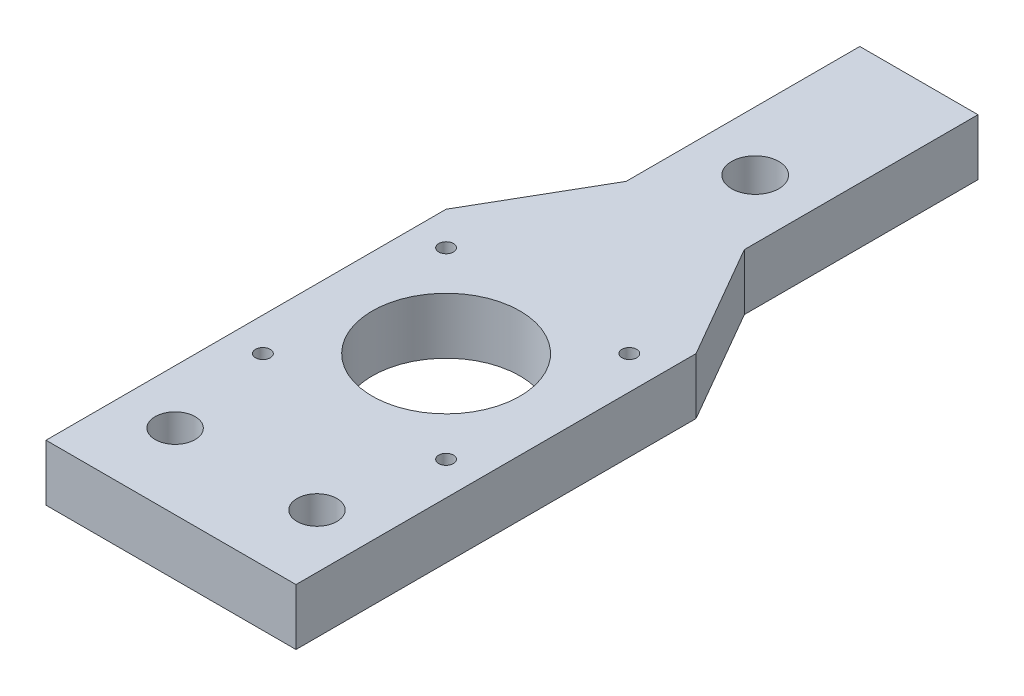
ISO-10303-21;
HEADER;
FILE_DESCRIPTION(('STEP AP214'),'2;1');
FILE_NAME('part.step','',(''),(''),'','','');
FILE_SCHEMA(('AUTOMOTIVE_DESIGN { 1 0 10303 214 1 1 1 1 }'));
ENDSEC;
DATA;
#1=APPLICATION_CONTEXT('core data for automotive mechanical design processes');
#2=APPLICATION_PROTOCOL_DEFINITION('international standard','automotive_design',2000,#1);
#3=PRODUCT_CONTEXT('',#1,'mechanical');
#4=PRODUCT('Part','Part','',(#3));
#5=PRODUCT_RELATED_PRODUCT_CATEGORY('part','',(#4));
#6=PRODUCT_DEFINITION_FORMATION('','',#4);
#7=PRODUCT_DEFINITION_CONTEXT('part definition',#1,'design');
#8=PRODUCT_DEFINITION('design','',#6,#7);
#9=PRODUCT_DEFINITION_SHAPE('','',#8);
#10=(LENGTH_UNIT() NAMED_UNIT(*) SI_UNIT(.MILLI.,.METRE.));
#11=(NAMED_UNIT(*) PLANE_ANGLE_UNIT() SI_UNIT($,.RADIAN.));
#12=(NAMED_UNIT(*) SI_UNIT($,.STERADIAN.) SOLID_ANGLE_UNIT());
#13=UNCERTAINTY_MEASURE_WITH_UNIT(LENGTH_MEASURE(1.E-05),#10,'distance_accuracy_value','');
#14=(GEOMETRIC_REPRESENTATION_CONTEXT(3) GLOBAL_UNCERTAINTY_ASSIGNED_CONTEXT((#13)) GLOBAL_UNIT_ASSIGNED_CONTEXT((#10,
#11,#12)) REPRESENTATION_CONTEXT('',''));
#15=CARTESIAN_POINT('',(0.,0.,0.));
#16=DIRECTION('',(0.,0.,1.));
#17=DIRECTION('',(1.,0.,0.));
#18=AXIS2_PLACEMENT_3D('',#15,#16,#17);
#19=CARTESIAN_POINT('',(0.,9.525,0.));
#20=DIRECTION('',(1.,0.,0.));
#21=DIRECTION('',(0.,0.,-1.));
#22=AXIS2_PLACEMENT_3D('',#19,#20,#21);
#23=PLANE('',#22);
#24=DIRECTION('',(0.,0.,1.));
#25=VECTOR('',#24,1.);
#26=CARTESIAN_POINT('',(0.,0.,0.));
#27=LINE('',#26,#25);
#28=CARTESIAN_POINT('',(0.,0.,0.));
#29=VERTEX_POINT('',#28);
#30=CARTESIAN_POINT('',(0.,0.,39.5376334956069));
#31=VERTEX_POINT('',#30);
#32=EDGE_CURVE('E148',#29,#31,#27,.T.);
#33=ORIENTED_EDGE('',*,*,#32,.T.);
#34=DIRECTION('',(0.,-1.,0.));
#35=VECTOR('',#34,1.);
#36=CARTESIAN_POINT('',(0.,9.525,39.5376334956069));
#37=LINE('',#36,#35);
#38=CARTESIAN_POINT('',(0.,9.525,39.5376334956069));
#39=VERTEX_POINT('',#38);
#40=EDGE_CURVE('E11',#39,#31,#37,.T.);
#41=ORIENTED_EDGE('',*,*,#40,.F.);
#42=DIRECTION('',(0.,0.,1.));
#43=VECTOR('',#42,1.);
#44=CARTESIAN_POINT('',(0.,9.525,0.));
#45=LINE('',#44,#43);
#46=CARTESIAN_POINT('',(0.,9.525,0.));
#47=VERTEX_POINT('',#46);
#48=EDGE_CURVE('E97',#47,#39,#45,.T.);
#49=ORIENTED_EDGE('',*,*,#48,.F.);
#50=DIRECTION('',(0.,-1.,0.));
#51=VECTOR('',#50,1.);
#52=CARTESIAN_POINT('',(0.,9.525,0.));
#53=LINE('',#52,#51);
#54=EDGE_CURVE('E65',#47,#29,#53,.T.);
#55=ORIENTED_EDGE('',*,*,#54,.T.);
#56=EDGE_LOOP('',(#33,#41,#49,#55));
#57=FACE_BOUND('',#56,.T.);
#58=ADVANCED_FACE('F47',(#57),#23,.F.);
#59=CARTESIAN_POINT('',(17.120297506357,9.525,9.88440837390164));
#60=DIRECTION('',(-0.86602540378444,0.,-0.499999999999998));
#61=DIRECTION('',(-0.499999999999998,0.,0.86602540378444));
#62=AXIS2_PLACEMENT_3D('',#59,#60,#61);
#63=PLANE('',#62);
#64=DIRECTION('',(0.499999999999998,0.,-0.86602540378444));
#65=VECTOR('',#64,1.);
#66=CARTESIAN_POINT('',(17.120297506357,0.,9.88440837390164));
#67=LINE('',#66,#65);
#68=CARTESIAN_POINT('',(-11.15,0.,58.85));
#69=VERTEX_POINT('',#68);
#70=EDGE_CURVE('E151',#69,#31,#67,.T.);
#71=ORIENTED_EDGE('',*,*,#70,.F.);
#72=DIRECTION('',(0.,-1.,0.));
#73=VECTOR('',#72,1.);
#74=CARTESIAN_POINT('',(-11.15,9.525,58.85));
#75=LINE('',#74,#73);
#76=CARTESIAN_POINT('',(-11.15,9.525,58.85));
#77=VERTEX_POINT('',#76);
#78=EDGE_CURVE('E57',#77,#69,#75,.T.);
#79=ORIENTED_EDGE('',*,*,#78,.F.);
#80=DIRECTION('',(0.499999999999998,0.,-0.86602540378444));
#81=VECTOR('',#80,1.);
#82=CARTESIAN_POINT('',(17.120297506357,9.525,9.88440837390164));
#83=LINE('',#82,#81);
#84=EDGE_CURVE('E257',#77,#39,#83,.T.);
#85=ORIENTED_EDGE('',*,*,#84,.T.);
#86=ORIENTED_EDGE('',*,*,#40,.T.);
#87=EDGE_LOOP('',(#71,#79,#85,#86));
#88=FACE_BOUND('',#87,.T.);
#89=ADVANCED_FACE('F190',(#88),#63,.T.);
#90=CARTESIAN_POINT('',(-11.15,9.525,0.));
#91=DIRECTION('',(-1.,0.,0.));
#92=DIRECTION('',(0.,0.,1.));
#93=AXIS2_PLACEMENT_3D('',#90,#91,#92);
#94=PLANE('',#93);
#95=DIRECTION('',(0.,0.,-1.));
#96=VECTOR('',#95,1.);
#97=CARTESIAN_POINT('',(-11.15,0.,0.));
#98=LINE('',#97,#96);
#99=CARTESIAN_POINT('',(-11.15,0.,126.55));
#100=VERTEX_POINT('',#99);
#101=EDGE_CURVE('E155',#100,#69,#98,.T.);
#102=ORIENTED_EDGE('',*,*,#101,.F.);
#103=DIRECTION('',(0.,1.,0.));
#104=VECTOR('',#103,1.);
#105=CARTESIAN_POINT('',(-11.15,-49.3401459260104,126.55));
#106=LINE('',#105,#104);
#107=CARTESIAN_POINT('',(-11.15,9.525,126.55));
#108=VERTEX_POINT('',#107);
#109=EDGE_CURVE('E206',#100,#108,#106,.T.);
#110=ORIENTED_EDGE('',*,*,#109,.T.);
#111=DIRECTION('',(0.,0.,-1.));
#112=VECTOR('',#111,1.);
#113=CARTESIAN_POINT('',(-11.15,9.525,0.));
#114=LINE('',#113,#112);
#115=EDGE_CURVE('E187',#108,#77,#114,.T.);
#116=ORIENTED_EDGE('',*,*,#115,.T.);
#117=ORIENTED_EDGE('',*,*,#78,.T.);
#118=EDGE_LOOP('',(#102,#110,#116,#117));
#119=FACE_BOUND('',#118,.T.);
#120=ADVANCED_FACE('F183',(#119),#94,.T.);
#121=CARTESIAN_POINT('',(31.15,9.525,0.));
#122=DIRECTION('',(-1.,0.,0.));
#123=DIRECTION('',(0.,0.,1.));
#124=AXIS2_PLACEMENT_3D('',#121,#122,#123);
#125=PLANE('',#124);
#126=DIRECTION('',(0.,0.,-1.));
#127=VECTOR('',#126,1.);
#128=CARTESIAN_POINT('',(31.15,0.,0.));
#129=LINE('',#128,#127);
#130=CARTESIAN_POINT('',(31.15,0.,126.55));
#131=VERTEX_POINT('',#130);
#132=CARTESIAN_POINT('',(31.15,0.,58.85));
#133=VERTEX_POINT('',#132);
#134=EDGE_CURVE('E159',#131,#133,#129,.T.);
#135=ORIENTED_EDGE('',*,*,#134,.T.);
#136=DIRECTION('',(0.,-1.,0.));
#137=VECTOR('',#136,1.);
#138=CARTESIAN_POINT('',(31.15,9.525,58.85));
#139=LINE('',#138,#137);
#140=CARTESIAN_POINT('',(31.15,9.525,58.85));
#141=VERTEX_POINT('',#140);
#142=EDGE_CURVE('E120',#141,#133,#139,.T.);
#143=ORIENTED_EDGE('',*,*,#142,.F.);
#144=DIRECTION('',(0.,0.,-1.));
#145=VECTOR('',#144,1.);
#146=CARTESIAN_POINT('',(31.15,9.525,0.));
#147=LINE('',#146,#145);
#148=CARTESIAN_POINT('',(31.15,9.525,126.55));
#149=VERTEX_POINT('',#148);
#150=EDGE_CURVE('E127',#149,#141,#147,.T.);
#151=ORIENTED_EDGE('',*,*,#150,.F.);
#152=DIRECTION('',(0.,1.,0.));
#153=VECTOR('',#152,1.);
#154=CARTESIAN_POINT('',(31.15,-49.3401459260104,126.55));
#155=LINE('',#154,#153);
#156=EDGE_CURVE('E203',#131,#149,#155,.T.);
#157=ORIENTED_EDGE('',*,*,#156,.F.);
#158=EDGE_LOOP('',(#135,#143,#151,#157));
#159=FACE_BOUND('',#158,.T.);
#160=ADVANCED_FACE('F266',(#159),#125,.F.);
#161=CARTESIAN_POINT('',(-2.12029750635697,9.525,1.22415433605728));
#162=DIRECTION('',(0.86602540378444,0.,-0.499999999999998));
#163=DIRECTION('',(-0.499999999999998,0.,-0.86602540378444));
#164=AXIS2_PLACEMENT_3D('',#161,#162,#163);
#165=PLANE('',#164);
#166=DIRECTION('',(0.499999999999998,0.,0.86602540378444));
#167=VECTOR('',#166,1.);
#168=CARTESIAN_POINT('',(-2.12029750635697,0.,1.22415433605728));
#169=LINE('',#168,#167);
#170=CARTESIAN_POINT('',(20.,0.,39.5376334956069));
#171=VERTEX_POINT('',#170);
#172=EDGE_CURVE('E115',#171,#133,#169,.T.);
#173=ORIENTED_EDGE('',*,*,#172,.F.);
#174=DIRECTION('',(0.,-1.,0.));
#175=VECTOR('',#174,1.);
#176=CARTESIAN_POINT('',(20.,9.525,39.5376334956069));
#177=LINE('',#176,#175);
#178=CARTESIAN_POINT('',(20.,9.525,39.5376334956069));
#179=VERTEX_POINT('',#178);
#180=EDGE_CURVE('E110',#179,#171,#177,.T.);
#181=ORIENTED_EDGE('',*,*,#180,.F.);
#182=DIRECTION('',(0.499999999999998,0.,0.86602540378444));
#183=VECTOR('',#182,1.);
#184=CARTESIAN_POINT('',(-2.12029750635697,9.525,1.22415433605728));
#185=LINE('',#184,#183);
#186=EDGE_CURVE('E113',#179,#141,#185,.T.);
#187=ORIENTED_EDGE('',*,*,#186,.T.);
#188=ORIENTED_EDGE('',*,*,#142,.T.);
#189=EDGE_LOOP('',(#173,#181,#187,#188));
#190=FACE_BOUND('',#189,.T.);
#191=ADVANCED_FACE('F112',(#190),#165,.T.);
#192=CARTESIAN_POINT('',(20.,9.525,0.));
#193=DIRECTION('',(1.,0.,0.));
#194=DIRECTION('',(0.,0.,-1.));
#195=AXIS2_PLACEMENT_3D('',#192,#193,#194);
#196=PLANE('',#195);
#197=DIRECTION('',(0.,0.,1.));
#198=VECTOR('',#197,1.);
#199=CARTESIAN_POINT('',(20.,0.,0.));
#200=LINE('',#199,#198);
#201=CARTESIAN_POINT('',(20.,0.,0.));
#202=VERTEX_POINT('',#201);
#203=EDGE_CURVE('E165',#202,#171,#200,.T.);
#204=ORIENTED_EDGE('',*,*,#203,.F.);
#205=DIRECTION('',(0.,-1.,0.));
#206=VECTOR('',#205,1.);
#207=CARTESIAN_POINT('',(20.,9.525,0.));
#208=LINE('',#207,#206);
#209=CARTESIAN_POINT('',(20.,9.525,0.));
#210=VERTEX_POINT('',#209);
#211=EDGE_CURVE('E85',#210,#202,#208,.T.);
#212=ORIENTED_EDGE('',*,*,#211,.F.);
#213=DIRECTION('',(0.,0.,1.));
#214=VECTOR('',#213,1.);
#215=CARTESIAN_POINT('',(20.,9.525,0.));
#216=LINE('',#215,#214);
#217=EDGE_CURVE('E124',#210,#179,#216,.T.);
#218=ORIENTED_EDGE('',*,*,#217,.T.);
#219=ORIENTED_EDGE('',*,*,#180,.T.);
#220=EDGE_LOOP('',(#204,#212,#218,#219));
#221=FACE_BOUND('',#220,.T.);
#222=ADVANCED_FACE('F131',(#221),#196,.T.);
#223=CARTESIAN_POINT('',(10.,9.525,27.7));
#224=DIRECTION('',(0.,-1.,0.));
#225=DIRECTION('',(0.,0.,-1.));
#226=AXIS2_PLACEMENT_3D('',#223,#224,#225);
#227=CYLINDRICAL_SURFACE('',#226,4.);
#228=CARTESIAN_POINT('',(10.,9.525,27.7));
#229=DIRECTION('',(0.,1.,0.));
#230=DIRECTION('',(0.,0.,1.));
#231=AXIS2_PLACEMENT_3D('',#228,#229,#230);
#232=CIRCLE('',#231,4.);
#233=CARTESIAN_POINT('',(10.,9.525,23.7));
#234=VERTEX_POINT('',#233);
#235=EDGE_CURVE('E251',#234,#234,#232,.T.);
#236=CARTESIAN_POINT('',(10.,0.,27.7));
#237=DIRECTION('',(0.,1.,0.));
#238=DIRECTION('',(0.,0.,1.));
#239=AXIS2_PLACEMENT_3D('',#236,#237,#238);
#240=CIRCLE('',#239,4.);
#241=CARTESIAN_POINT('',(10.,0.,23.7));
#242=VERTEX_POINT('',#241);
#243=EDGE_CURVE('E143',#242,#242,#240,.T.);
#244=CARTESIAN_POINT('',(10.,9.525,23.7));
#245=CARTESIAN_POINT('',(10.,9.42578125,23.7));
#246=CARTESIAN_POINT('',(10.,9.3265625,23.7));
#247=CARTESIAN_POINT('',(10.,9.128125,23.7));
#248=CARTESIAN_POINT('',(10.,9.02890625,23.7));
#249=CARTESIAN_POINT('',(10.,8.83046875,23.7));
#250=CARTESIAN_POINT('',(10.,8.73125,23.7));
#251=CARTESIAN_POINT('',(10.,8.5328125,23.7));
#252=CARTESIAN_POINT('',(10.,8.43359375,23.7));
#253=CARTESIAN_POINT('',(10.,8.23515625,23.7));
#254=CARTESIAN_POINT('',(10.,8.1359375,23.7));
#255=CARTESIAN_POINT('',(10.,7.9375,23.7));
#256=CARTESIAN_POINT('',(10.,7.83828125,23.7));
#257=CARTESIAN_POINT('',(10.,7.63984375,23.7));
#258=CARTESIAN_POINT('',(10.,7.540625,23.7));
#259=CARTESIAN_POINT('',(10.,7.3421875,23.7));
#260=CARTESIAN_POINT('',(10.,7.24296875,23.7));
#261=CARTESIAN_POINT('',(10.,7.04453125,23.7));
#262=CARTESIAN_POINT('',(10.,6.9453125,23.7));
#263=CARTESIAN_POINT('',(10.,6.746875,23.7));
#264=CARTESIAN_POINT('',(10.,6.64765625,23.7));
#265=CARTESIAN_POINT('',(10.,6.44921875,23.7));
#266=CARTESIAN_POINT('',(10.,6.35,23.7));
#267=CARTESIAN_POINT('',(10.,6.1515625,23.7));
#268=CARTESIAN_POINT('',(10.,6.05234375,23.7));
#269=CARTESIAN_POINT('',(10.,5.85390625,23.7));
#270=CARTESIAN_POINT('',(10.,5.7546875,23.7));
#271=CARTESIAN_POINT('',(10.,5.55625,23.7));
#272=CARTESIAN_POINT('',(10.,5.45703125,23.7));
#273=CARTESIAN_POINT('',(10.,5.25859375,23.7));
#274=CARTESIAN_POINT('',(10.,5.159375,23.7));
#275=CARTESIAN_POINT('',(10.,4.9609375,23.7));
#276=CARTESIAN_POINT('',(10.,4.86171875,23.7));
#277=CARTESIAN_POINT('',(10.,4.66328125,23.7));
#278=CARTESIAN_POINT('',(10.,4.5640625,23.7));
#279=CARTESIAN_POINT('',(10.,4.365625,23.7));
#280=CARTESIAN_POINT('',(10.,4.26640625,23.7));
#281=CARTESIAN_POINT('',(10.,4.06796875,23.7));
#282=CARTESIAN_POINT('',(10.,3.96875,23.7));
#283=CARTESIAN_POINT('',(10.,3.7703125,23.7));
#284=CARTESIAN_POINT('',(10.,3.67109375,23.7));
#285=CARTESIAN_POINT('',(10.,3.47265625,23.7));
#286=CARTESIAN_POINT('',(10.,3.3734375,23.7));
#287=CARTESIAN_POINT('',(10.,3.175,23.7));
#288=CARTESIAN_POINT('',(10.,3.07578125,23.7));
#289=CARTESIAN_POINT('',(10.,2.87734375,23.7));
#290=CARTESIAN_POINT('',(10.,2.778125,23.7));
#291=CARTESIAN_POINT('',(10.,2.5796875,23.7));
#292=CARTESIAN_POINT('',(10.,2.48046875,23.7));
#293=CARTESIAN_POINT('',(10.,2.28203125,23.7));
#294=CARTESIAN_POINT('',(10.,2.1828125,23.7));
#295=CARTESIAN_POINT('',(10.,1.984375,23.7));
#296=CARTESIAN_POINT('',(10.,1.88515625,23.7));
#297=CARTESIAN_POINT('',(10.,1.68671875,23.7));
#298=CARTESIAN_POINT('',(10.,1.5875,23.7));
#299=CARTESIAN_POINT('',(10.,1.3890625,23.7));
#300=CARTESIAN_POINT('',(10.,1.28984375,23.7));
#301=CARTESIAN_POINT('',(10.,1.09140625,23.7));
#302=CARTESIAN_POINT('',(10.,0.992187500000001,23.7));
#303=CARTESIAN_POINT('',(10.,0.793750000000001,23.7));
#304=CARTESIAN_POINT('',(10.,0.69453125,23.7));
#305=CARTESIAN_POINT('',(10.,0.49609375,23.7));
#306=CARTESIAN_POINT('',(10.,0.396875,23.7));
#307=CARTESIAN_POINT('',(10.,0.1984375,23.7));
#308=CARTESIAN_POINT('',(10.,0.0992187500000001,23.7));
#309=CARTESIAN_POINT('',(10.,0.,23.7));
#310=B_SPLINE_CURVE_WITH_KNOTS('',3,(#244,#245,#246,#247,#248,#249,#250,#251,#252,#253,#254,
#255,#256,#257,#258,#259,#260,#261,#262,#263,#264,#265,#266,#267,#268,#269,#270,#271,#272,#273,
#274,#275,#276,#277,#278,#279,#280,#281,#282,#283,#284,#285,#286,#287,#288,#289,#290,#291,#292,
#293,#294,#295,#296,#297,#298,#299,#300,#301,#302,#303,#304,#305,#306,#307,#308,#309),
.UNSPECIFIED.,.F.,.F.,(4,2,2,2,2,2,2,2,2,2,2,2,2,2,2,2,2,2,2,2,2,2,2,2,2,2,2,2,2,2,2,2,4),(0.,
0.297656249999998,0.595312499999999,0.892968749999999,1.190625,1.48828125,1.7859375,2.08359375,
2.38125,2.67890625,2.9765625,3.27421875,3.571875,3.86953125,4.1671875,4.46484375,4.7625,
5.06015625,5.3578125,5.65546875,5.953125,6.25078125,6.5484375,6.84609375,7.14375,7.44140625,
7.7390625,8.03671875,8.334375,8.63203125,8.9296875,9.22734375,9.525),.UNSPECIFIED.);
#311=EDGE_CURVE('BSEAM277',#234,#242,#310,.T.);
#312=ORIENTED_EDGE('',*,*,#235,.T.);
#313=ORIENTED_EDGE('',*,*,#243,.F.);
#314=ORIENTED_EDGE('',*,*,#311,.T.);
#315=ORIENTED_EDGE('',*,*,#311,.F.);
#316=EDGE_LOOP('',(#312,#314,#313,#315));
#317=FACE_BOUND('',#316,.T.);
#318=ADVANCED_FACE('F277',(#317),#227,.F.);
#319=CARTESIAN_POINT('',(10.,9.525,80.));
#320=DIRECTION('',(0.,-1.,0.));
#321=DIRECTION('',(0.,0.,-1.));
#322=AXIS2_PLACEMENT_3D('',#319,#320,#321);
#323=CYLINDRICAL_SURFACE('',#322,12.5);
#324=CARTESIAN_POINT('',(10.,9.525,80.));
#325=DIRECTION('',(0.,1.,0.));
#326=DIRECTION('',(0.,0.,1.));
#327=AXIS2_PLACEMENT_3D('',#324,#325,#326);
#328=CIRCLE('',#327,12.5);
#329=CARTESIAN_POINT('',(10.,9.525,67.5));
#330=VERTEX_POINT('',#329);
#331=EDGE_CURVE('E172',#330,#330,#328,.T.);
#332=CARTESIAN_POINT('',(10.,0.,80.));
#333=DIRECTION('',(0.,1.,0.));
#334=DIRECTION('',(0.,0.,1.));
#335=AXIS2_PLACEMENT_3D('',#332,#333,#334);
#336=CIRCLE('',#335,12.5);
#337=CARTESIAN_POINT('',(10.,0.,67.5));
#338=VERTEX_POINT('',#337);
#339=EDGE_CURVE('E139',#338,#338,#336,.T.);
#340=CARTESIAN_POINT('',(10.,9.525,67.5));
#341=CARTESIAN_POINT('',(10.,9.42578125,67.5));
#342=CARTESIAN_POINT('',(10.,9.3265625,67.5));
#343=CARTESIAN_POINT('',(10.,9.128125,67.5));
#344=CARTESIAN_POINT('',(10.,9.02890625,67.5));
#345=CARTESIAN_POINT('',(10.,8.83046875,67.5));
#346=CARTESIAN_POINT('',(10.,8.73125,67.5));
#347=CARTESIAN_POINT('',(10.,8.5328125,67.5));
#348=CARTESIAN_POINT('',(10.,8.43359375,67.5));
#349=CARTESIAN_POINT('',(10.,8.23515625,67.5));
#350=CARTESIAN_POINT('',(10.,8.1359375,67.5));
#351=CARTESIAN_POINT('',(10.,7.9375,67.5));
#352=CARTESIAN_POINT('',(10.,7.83828125,67.5));
#353=CARTESIAN_POINT('',(10.,7.63984375,67.5));
#354=CARTESIAN_POINT('',(10.,7.540625,67.5));
#355=CARTESIAN_POINT('',(10.,7.3421875,67.5));
#356=CARTESIAN_POINT('',(10.,7.24296875,67.5));
#357=CARTESIAN_POINT('',(10.,7.04453125,67.5));
#358=CARTESIAN_POINT('',(10.,6.9453125,67.5));
#359=CARTESIAN_POINT('',(10.,6.746875,67.5));
#360=CARTESIAN_POINT('',(10.,6.64765625,67.5));
#361=CARTESIAN_POINT('',(10.,6.44921875,67.5));
#362=CARTESIAN_POINT('',(10.,6.35,67.5));
#363=CARTESIAN_POINT('',(10.,6.1515625,67.5));
#364=CARTESIAN_POINT('',(10.,6.05234375,67.5));
#365=CARTESIAN_POINT('',(10.,5.85390625,67.5));
#366=CARTESIAN_POINT('',(10.,5.7546875,67.5));
#367=CARTESIAN_POINT('',(10.,5.55625,67.5));
#368=CARTESIAN_POINT('',(10.,5.45703125,67.5));
#369=CARTESIAN_POINT('',(10.,5.25859375,67.5));
#370=CARTESIAN_POINT('',(10.,5.159375,67.5));
#371=CARTESIAN_POINT('',(10.,4.9609375,67.5));
#372=CARTESIAN_POINT('',(10.,4.86171875,67.5));
#373=CARTESIAN_POINT('',(10.,4.66328125,67.5));
#374=CARTESIAN_POINT('',(10.,4.5640625,67.5));
#375=CARTESIAN_POINT('',(10.,4.365625,67.5));
#376=CARTESIAN_POINT('',(10.,4.26640625,67.5));
#377=CARTESIAN_POINT('',(10.,4.06796875,67.5));
#378=CARTESIAN_POINT('',(10.,3.96875,67.5));
#379=CARTESIAN_POINT('',(10.,3.7703125,67.5));
#380=CARTESIAN_POINT('',(10.,3.67109375,67.5));
#381=CARTESIAN_POINT('',(10.,3.47265625,67.5));
#382=CARTESIAN_POINT('',(10.,3.3734375,67.5));
#383=CARTESIAN_POINT('',(10.,3.175,67.5));
#384=CARTESIAN_POINT('',(10.,3.07578125,67.5));
#385=CARTESIAN_POINT('',(10.,2.87734375,67.5));
#386=CARTESIAN_POINT('',(10.,2.778125,67.5));
#387=CARTESIAN_POINT('',(10.,2.5796875,67.5));
#388=CARTESIAN_POINT('',(10.,2.48046875,67.5));
#389=CARTESIAN_POINT('',(10.,2.28203125,67.5));
#390=CARTESIAN_POINT('',(10.,2.1828125,67.5));
#391=CARTESIAN_POINT('',(10.,1.984375,67.5));
#392=CARTESIAN_POINT('',(10.,1.88515625,67.5));
#393=CARTESIAN_POINT('',(10.,1.68671875,67.5));
#394=CARTESIAN_POINT('',(10.,1.5875,67.5));
#395=CARTESIAN_POINT('',(10.,1.3890625,67.5));
#396=CARTESIAN_POINT('',(10.,1.28984375,67.5));
#397=CARTESIAN_POINT('',(10.,1.09140625,67.5));
#398=CARTESIAN_POINT('',(10.,0.992187500000001,67.5));
#399=CARTESIAN_POINT('',(10.,0.793750000000001,67.5));
#400=CARTESIAN_POINT('',(10.,0.69453125,67.5));
#401=CARTESIAN_POINT('',(10.,0.49609375,67.5));
#402=CARTESIAN_POINT('',(10.,0.396875,67.5));
#403=CARTESIAN_POINT('',(10.,0.1984375,67.5));
#404=CARTESIAN_POINT('',(10.,0.0992187500000001,67.5));
#405=CARTESIAN_POINT('',(10.,0.,67.5));
#406=B_SPLINE_CURVE_WITH_KNOTS('',3,(#340,#341,#342,#343,#344,#345,#346,#347,#348,#349,#350,
#351,#352,#353,#354,#355,#356,#357,#358,#359,#360,#361,#362,#363,#364,#365,#366,#367,#368,#369,
#370,#371,#372,#373,#374,#375,#376,#377,#378,#379,#380,#381,#382,#383,#384,#385,#386,#387,#388,
#389,#390,#391,#392,#393,#394,#395,#396,#397,#398,#399,#400,#401,#402,#403,#404,#405),
.UNSPECIFIED.,.F.,.F.,(4,2,2,2,2,2,2,2,2,2,2,2,2,2,2,2,2,2,2,2,2,2,2,2,2,2,2,2,2,2,2,2,4),(0.,
0.29765625,0.5953125,0.892968750000001,1.190625,1.48828125,1.7859375,2.08359375,2.38125,
2.67890625,2.9765625,3.27421875,3.571875,3.86953125,4.1671875,4.46484375,4.7625,5.06015625,
5.3578125,5.65546875,5.953125,6.25078125,6.5484375,6.84609375,7.14375,7.44140625,7.7390625,
8.03671875,8.334375,8.63203125,8.9296875,9.22734375,9.525),.UNSPECIFIED.);
#407=EDGE_CURVE('BSEAM49',#330,#338,#406,.T.);
#408=ORIENTED_EDGE('',*,*,#331,.T.);
#409=ORIENTED_EDGE('',*,*,#339,.F.);
#410=ORIENTED_EDGE('',*,*,#407,.T.);
#411=ORIENTED_EDGE('',*,*,#407,.F.);
#412=EDGE_LOOP('',(#408,#410,#409,#411));
#413=FACE_BOUND('',#412,.T.);
#414=ADVANCED_FACE('F49',(#413),#323,.F.);
#415=CARTESIAN_POINT('',(0.,9.525,0.));
#416=DIRECTION('',(0.,0.,-1.));
#417=DIRECTION('',(-1.,0.,0.));
#418=AXIS2_PLACEMENT_3D('',#415,#416,#417);
#419=PLANE('',#418);
#420=DIRECTION('',(1.,0.,0.));
#421=VECTOR('',#420,1.);
#422=CARTESIAN_POINT('',(0.,0.,0.));
#423=LINE('',#422,#421);
#424=EDGE_CURVE('E168',#29,#202,#423,.T.);
#425=ORIENTED_EDGE('',*,*,#424,.F.);
#426=ORIENTED_EDGE('',*,*,#54,.F.);
#427=DIRECTION('',(1.,0.,0.));
#428=VECTOR('',#427,1.);
#429=CARTESIAN_POINT('',(0.,9.525,0.));
#430=LINE('',#429,#428);
#431=EDGE_CURVE('E133',#47,#210,#430,.T.);
#432=ORIENTED_EDGE('',*,*,#431,.T.);
#433=ORIENTED_EDGE('',*,*,#211,.T.);
#434=EDGE_LOOP('',(#425,#426,#432,#433));
#435=FACE_BOUND('',#434,.T.);
#436=ADVANCED_FACE('F267',(#435),#419,.T.);
#437=CARTESIAN_POINT('',(0.,9.525,0.));
#438=DIRECTION('',(0.,1.,0.));
#439=DIRECTION('',(0.,0.,1.));
#440=AXIS2_PLACEMENT_3D('',#437,#438,#439);
#441=PLANE('',#440);
#442=CARTESIAN_POINT('',(-2.,9.525,113.85));
#443=DIRECTION('',(0.,1.,0.));
#444=DIRECTION('',(0.,0.,1.));
#445=AXIS2_PLACEMENT_3D('',#442,#443,#444);
#446=CIRCLE('',#445,3.37819999999999);
#447=CARTESIAN_POINT('',(-2.,9.525,117.2282));
#448=VERTEX_POINT('',#447);
#449=EDGE_CURVE('E335',#448,#448,#446,.T.);
#450=ORIENTED_EDGE('',*,*,#449,.F.);
#451=EDGE_LOOP('',(#450));
#452=FACE_BOUND('',#451,.T.);
#453=CARTESIAN_POINT('',(22.,9.525,113.85));
#454=DIRECTION('',(0.,1.,0.));
#455=DIRECTION('',(0.,0.,1.));
#456=AXIS2_PLACEMENT_3D('',#453,#454,#455);
#457=CIRCLE('',#456,3.37819999999999);
#458=CARTESIAN_POINT('',(22.,9.525,117.2282));
#459=VERTEX_POINT('',#458);
#460=EDGE_CURVE('E339',#459,#459,#457,.T.);
#461=ORIENTED_EDGE('',*,*,#460,.F.);
#462=EDGE_LOOP('',(#461));
#463=FACE_BOUND('',#462,.T.);
#464=CARTESIAN_POINT('',(-5.49999999999999,9.525,64.5));
#465=DIRECTION('',(0.,1.,0.));
#466=DIRECTION('',(0.,0.,1.));
#467=AXIS2_PLACEMENT_3D('',#464,#465,#466);
#468=CIRCLE('',#467,1.25);
#469=CARTESIAN_POINT('',(-5.49999999999999,9.525,65.75));
#470=VERTEX_POINT('',#469);
#471=EDGE_CURVE('E202',#470,#470,#468,.T.);
#472=ORIENTED_EDGE('',*,*,#471,.F.);
#473=EDGE_LOOP('',(#472));
#474=FACE_BOUND('',#473,.T.);
#475=CARTESIAN_POINT('',(25.5,9.525,64.5));
#476=DIRECTION('',(0.,1.,0.));
#477=DIRECTION('',(0.,0.,1.));
#478=AXIS2_PLACEMENT_3D('',#475,#476,#477);
#479=CIRCLE('',#478,1.25);
#480=CARTESIAN_POINT('',(25.5,9.525,65.75));
#481=VERTEX_POINT('',#480);
#482=EDGE_CURVE('E225',#481,#481,#479,.T.);
#483=ORIENTED_EDGE('',*,*,#482,.F.);
#484=EDGE_LOOP('',(#483));
#485=FACE_BOUND('',#484,.T.);
#486=CARTESIAN_POINT('',(25.5,9.525,95.5));
#487=DIRECTION('',(0.,1.,0.));
#488=DIRECTION('',(0.,0.,1.));
#489=AXIS2_PLACEMENT_3D('',#486,#487,#488);
#490=CIRCLE('',#489,1.25);
#491=CARTESIAN_POINT('',(25.5,9.525,96.75));
#492=VERTEX_POINT('',#491);
#493=EDGE_CURVE('E233',#492,#492,#490,.T.);
#494=ORIENTED_EDGE('',*,*,#493,.F.);
#495=EDGE_LOOP('',(#494));
#496=FACE_BOUND('',#495,.T.);
#497=CARTESIAN_POINT('',(-5.49999999999999,9.525,95.5));
#498=DIRECTION('',(0.,1.,0.));
#499=DIRECTION('',(0.,0.,1.));
#500=AXIS2_PLACEMENT_3D('',#497,#498,#499);
#501=CIRCLE('',#500,1.25);
#502=CARTESIAN_POINT('',(-5.49999999999999,9.525,96.75));
#503=VERTEX_POINT('',#502);
#504=EDGE_CURVE('E241',#503,#503,#501,.T.);
#505=ORIENTED_EDGE('',*,*,#504,.F.);
#506=EDGE_LOOP('',(#505));
#507=FACE_BOUND('',#506,.T.);
#508=ORIENTED_EDGE('',*,*,#331,.F.);
#509=EDGE_LOOP('',(#508));
#510=FACE_BOUND('',#509,.T.);
#511=ORIENTED_EDGE('',*,*,#235,.F.);
#512=EDGE_LOOP('',(#511));
#513=FACE_BOUND('',#512,.T.);
#514=ORIENTED_EDGE('',*,*,#48,.T.);
#515=ORIENTED_EDGE('',*,*,#84,.F.);
#516=ORIENTED_EDGE('',*,*,#115,.F.);
#517=DIRECTION('',(1.,0.,0.));
#518=VECTOR('',#517,1.);
#519=CARTESIAN_POINT('',(-11.15,9.525,126.55));
#520=LINE('',#519,#518);
#521=EDGE_CURVE('E209',#108,#149,#520,.T.);
#522=ORIENTED_EDGE('',*,*,#521,.T.);
#523=ORIENTED_EDGE('',*,*,#150,.T.);
#524=ORIENTED_EDGE('',*,*,#186,.F.);
#525=ORIENTED_EDGE('',*,*,#217,.F.);
#526=ORIENTED_EDGE('',*,*,#431,.F.);
#527=EDGE_LOOP('',(#514,#515,#516,#522,#523,#524,#525,#526));
#528=FACE_BOUND('',#527,.T.);
#529=ADVANCED_FACE('F123',(#452,#463,#474,#485,#496,#507,#510,#513,#528),#441,.T.);
#530=CARTESIAN_POINT('',(0.,0.,0.));
#531=DIRECTION('',(0.,1.,0.));
#532=DIRECTION('',(0.,0.,1.));
#533=AXIS2_PLACEMENT_3D('',#530,#531,#532);
#534=PLANE('',#533);
#535=CARTESIAN_POINT('',(-2.,0.,113.85));
#536=DIRECTION('',(0.,1.,0.));
#537=DIRECTION('',(0.,0.,1.));
#538=AXIS2_PLACEMENT_3D('',#535,#536,#537);
#539=CIRCLE('',#538,3.3782);
#540=CARTESIAN_POINT('',(-2.,0.,117.2282));
#541=VERTEX_POINT('',#540);
#542=EDGE_CURVE('E332',#541,#541,#539,.T.);
#543=ORIENTED_EDGE('',*,*,#542,.T.);
#544=EDGE_LOOP('',(#543));
#545=FACE_BOUND('',#544,.T.);
#546=CARTESIAN_POINT('',(22.,0.,113.85));
#547=DIRECTION('',(0.,1.,0.));
#548=DIRECTION('',(0.,0.,1.));
#549=AXIS2_PLACEMENT_3D('',#546,#547,#548);
#550=CIRCLE('',#549,3.3782);
#551=CARTESIAN_POINT('',(22.,0.,117.2282));
#552=VERTEX_POINT('',#551);
#553=EDGE_CURVE('E215',#552,#552,#550,.T.);
#554=ORIENTED_EDGE('',*,*,#553,.T.);
#555=EDGE_LOOP('',(#554));
#556=FACE_BOUND('',#555,.T.);
#557=CARTESIAN_POINT('',(-5.49999999999999,0.,64.5));
#558=DIRECTION('',(0.,1.,0.));
#559=DIRECTION('',(0.,0.,1.));
#560=AXIS2_PLACEMENT_3D('',#557,#558,#559);
#561=CIRCLE('',#560,1.25);
#562=CARTESIAN_POINT('',(-5.49999999999999,0.,65.75));
#563=VERTEX_POINT('',#562);
#564=EDGE_CURVE('E221',#563,#563,#561,.T.);
#565=ORIENTED_EDGE('',*,*,#564,.T.);
#566=EDGE_LOOP('',(#565));
#567=FACE_BOUND('',#566,.T.);
#568=CARTESIAN_POINT('',(25.5,0.,64.5));
#569=DIRECTION('',(0.,1.,0.));
#570=DIRECTION('',(0.,0.,1.));
#571=AXIS2_PLACEMENT_3D('',#568,#569,#570);
#572=CIRCLE('',#571,1.25);
#573=CARTESIAN_POINT('',(25.5,0.,65.75));
#574=VERTEX_POINT('',#573);
#575=EDGE_CURVE('E229',#574,#574,#572,.T.);
#576=ORIENTED_EDGE('',*,*,#575,.T.);
#577=EDGE_LOOP('',(#576));
#578=FACE_BOUND('',#577,.T.);
#579=CARTESIAN_POINT('',(25.5,0.,95.5));
#580=DIRECTION('',(0.,1.,0.));
#581=DIRECTION('',(0.,0.,1.));
#582=AXIS2_PLACEMENT_3D('',#579,#580,#581);
#583=CIRCLE('',#582,1.25);
#584=CARTESIAN_POINT('',(25.5,0.,96.75));
#585=VERTEX_POINT('',#584);
#586=EDGE_CURVE('E237',#585,#585,#583,.T.);
#587=ORIENTED_EDGE('',*,*,#586,.T.);
#588=EDGE_LOOP('',(#587));
#589=FACE_BOUND('',#588,.T.);
#590=CARTESIAN_POINT('',(-5.49999999999999,0.,95.5));
#591=DIRECTION('',(0.,1.,0.));
#592=DIRECTION('',(0.,0.,1.));
#593=AXIS2_PLACEMENT_3D('',#590,#591,#592);
#594=CIRCLE('',#593,1.25);
#595=CARTESIAN_POINT('',(-5.49999999999999,0.,96.75));
#596=VERTEX_POINT('',#595);
#597=EDGE_CURVE('E144',#596,#596,#594,.T.);
#598=ORIENTED_EDGE('',*,*,#597,.T.);
#599=EDGE_LOOP('',(#598));
#600=FACE_BOUND('',#599,.T.);
#601=ORIENTED_EDGE('',*,*,#339,.T.);
#602=EDGE_LOOP('',(#601));
#603=FACE_BOUND('',#602,.T.);
#604=ORIENTED_EDGE('',*,*,#243,.T.);
#605=EDGE_LOOP('',(#604));
#606=FACE_BOUND('',#605,.T.);
#607=ORIENTED_EDGE('',*,*,#32,.F.);
#608=ORIENTED_EDGE('',*,*,#424,.T.);
#609=ORIENTED_EDGE('',*,*,#203,.T.);
#610=ORIENTED_EDGE('',*,*,#172,.T.);
#611=ORIENTED_EDGE('',*,*,#134,.F.);
#612=DIRECTION('',(-1.,0.,0.));
#613=VECTOR('',#612,1.);
#614=CARTESIAN_POINT('',(-11.15,0.,126.55));
#615=LINE('',#614,#613);
#616=EDGE_CURVE('E195',#131,#100,#615,.T.);
#617=ORIENTED_EDGE('',*,*,#616,.T.);
#618=ORIENTED_EDGE('',*,*,#101,.T.);
#619=ORIENTED_EDGE('',*,*,#70,.T.);
#620=EDGE_LOOP('',(#607,#608,#609,#610,#611,#617,#618,#619));
#621=FACE_BOUND('',#620,.T.);
#622=ADVANCED_FACE('F192',(#545,#556,#567,#578,#589,#600,#603,#606,#621),#534,.F.);
#623=CARTESIAN_POINT('',(-5.49999999999999,9.525,95.5));
#624=DIRECTION('',(0.,1.,0.));
#625=DIRECTION('',(0.,0.,1.));
#626=AXIS2_PLACEMENT_3D('',#623,#624,#625);
#627=CYLINDRICAL_SURFACE('',#626,1.25);
#628=ORIENTED_EDGE('',*,*,#597,.F.);
#629=EDGE_LOOP('',(#628));
#630=FACE_BOUND('',#629,.T.);
#631=ORIENTED_EDGE('',*,*,#504,.T.);
#632=EDGE_LOOP('',(#631));
#633=FACE_BOUND('',#632,.T.);
#634=ADVANCED_FACE('F298',(#630,#633),#627,.F.);
#635=CARTESIAN_POINT('',(25.5,9.525,95.5));
#636=DIRECTION('',(0.,1.,0.));
#637=DIRECTION('',(0.,0.,1.));
#638=AXIS2_PLACEMENT_3D('',#635,#636,#637);
#639=CYLINDRICAL_SURFACE('',#638,1.25);
#640=ORIENTED_EDGE('',*,*,#586,.F.);
#641=EDGE_LOOP('',(#640));
#642=FACE_BOUND('',#641,.T.);
#643=ORIENTED_EDGE('',*,*,#493,.T.);
#644=EDGE_LOOP('',(#643));
#645=FACE_BOUND('',#644,.T.);
#646=ADVANCED_FACE('F303',(#642,#645),#639,.F.);
#647=CARTESIAN_POINT('',(25.5,9.525,64.5));
#648=DIRECTION('',(0.,1.,0.));
#649=DIRECTION('',(0.,0.,1.));
#650=AXIS2_PLACEMENT_3D('',#647,#648,#649);
#651=CYLINDRICAL_SURFACE('',#650,1.25);
#652=ORIENTED_EDGE('',*,*,#575,.F.);
#653=EDGE_LOOP('',(#652));
#654=FACE_BOUND('',#653,.T.);
#655=ORIENTED_EDGE('',*,*,#482,.T.);
#656=EDGE_LOOP('',(#655));
#657=FACE_BOUND('',#656,.T.);
#658=ADVANCED_FACE('F311',(#654,#657),#651,.F.);
#659=CARTESIAN_POINT('',(-5.49999999999999,9.525,64.5));
#660=DIRECTION('',(0.,1.,0.));
#661=DIRECTION('',(0.,0.,1.));
#662=AXIS2_PLACEMENT_3D('',#659,#660,#661);
#663=CYLINDRICAL_SURFACE('',#662,1.25);
#664=ORIENTED_EDGE('',*,*,#564,.F.);
#665=EDGE_LOOP('',(#664));
#666=FACE_BOUND('',#665,.T.);
#667=ORIENTED_EDGE('',*,*,#471,.T.);
#668=EDGE_LOOP('',(#667));
#669=FACE_BOUND('',#668,.T.);
#670=ADVANCED_FACE('F315',(#666,#669),#663,.F.);
#671=CARTESIAN_POINT('',(-11.15,-49.3401459260104,126.55));
#672=DIRECTION('',(0.,0.,1.));
#673=DIRECTION('',(1.,0.,0.));
#674=AXIS2_PLACEMENT_3D('',#671,#672,#673);
#675=PLANE('',#674);
#676=ORIENTED_EDGE('',*,*,#616,.F.);
#677=ORIENTED_EDGE('',*,*,#156,.T.);
#678=ORIENTED_EDGE('',*,*,#521,.F.);
#679=ORIENTED_EDGE('',*,*,#109,.F.);
#680=EDGE_LOOP('',(#676,#677,#678,#679));
#681=FACE_BOUND('',#680,.T.);
#682=ADVANCED_FACE('F207',(#681),#675,.T.);
#683=CARTESIAN_POINT('',(22.,9.525,113.85));
#684=DIRECTION('',(0.,1.,0.));
#685=DIRECTION('',(0.,0.,1.));
#686=AXIS2_PLACEMENT_3D('',#683,#684,#685);
#687=CYLINDRICAL_SURFACE('',#686,3.37819999999999);
#688=ORIENTED_EDGE('',*,*,#553,.F.);
#689=EDGE_LOOP('',(#688));
#690=FACE_BOUND('',#689,.T.);
#691=ORIENTED_EDGE('',*,*,#460,.T.);
#692=EDGE_LOOP('',(#691));
#693=FACE_BOUND('',#692,.T.);
#694=ADVANCED_FACE('F322',(#690,#693),#687,.F.);
#695=CARTESIAN_POINT('',(-2.,9.525,113.85));
#696=DIRECTION('',(0.,1.,0.));
#697=DIRECTION('',(0.,0.,1.));
#698=AXIS2_PLACEMENT_3D('',#695,#696,#697);
#699=CYLINDRICAL_SURFACE('',#698,3.37819999999999);
#700=ORIENTED_EDGE('',*,*,#542,.F.);
#701=EDGE_LOOP('',(#700));
#702=FACE_BOUND('',#701,.T.);
#703=ORIENTED_EDGE('',*,*,#449,.T.);
#704=EDGE_LOOP('',(#703));
#705=FACE_BOUND('',#704,.T.);
#706=ADVANCED_FACE('F324',(#702,#705),#699,.F.);
#707=CLOSED_SHELL('',(#58,#89,#120,#160,#191,#222,#318,#414,#436,#529,#622,#634,#646,#658,#670,
#682,#694,#706));
#708=MANIFOLD_SOLID_BREP('B2',#707);
#709=ADVANCED_BREP_SHAPE_REPRESENTATION('',(#18,#708),#14);
#710=SHAPE_DEFINITION_REPRESENTATION(#9,#709);
ENDSEC;
END-ISO-10303-21;
